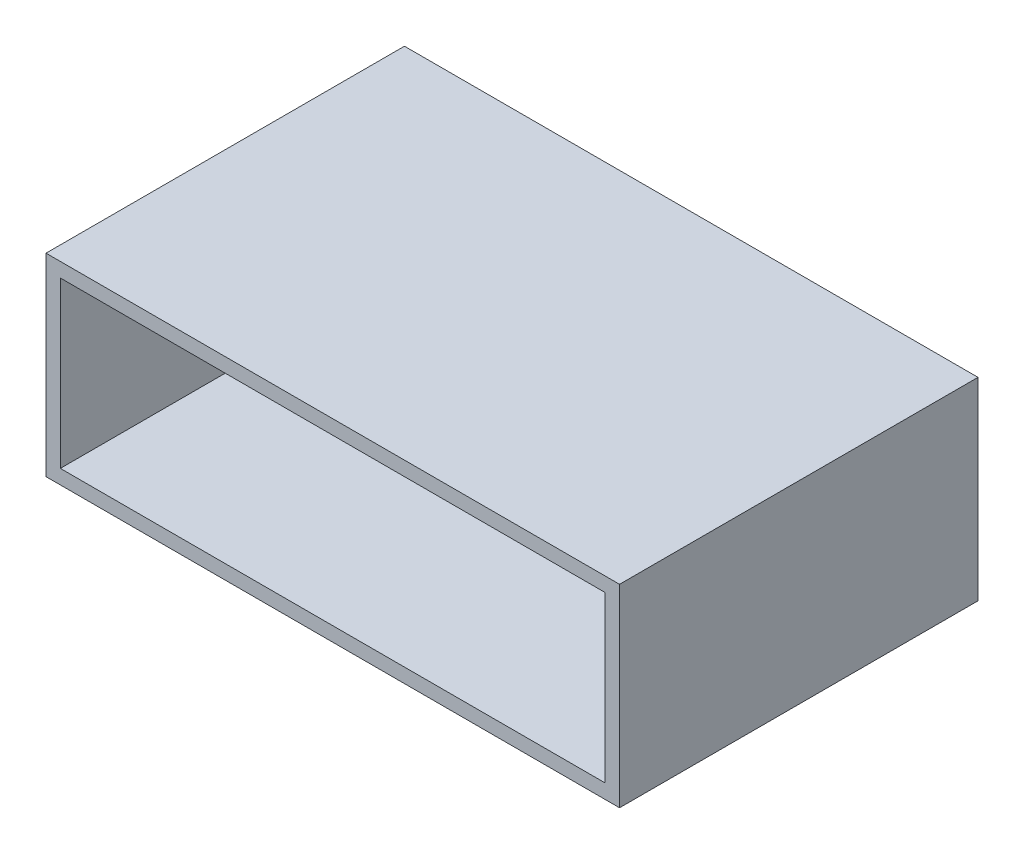
ISO-10303-21;
HEADER;
FILE_DESCRIPTION(('STEP AP214'),'2;1');
FILE_NAME('part.step','',(''),(''),'','','');
FILE_SCHEMA(('AUTOMOTIVE_DESIGN { 1 0 10303 214 1 1 1 1 }'));
ENDSEC;
DATA;
#1=APPLICATION_CONTEXT('core data for automotive mechanical design processes');
#2=APPLICATION_PROTOCOL_DEFINITION('international standard','automotive_design',2000,#1);
#3=PRODUCT_CONTEXT('',#1,'mechanical');
#4=PRODUCT('Part','Part','',(#3));
#5=PRODUCT_RELATED_PRODUCT_CATEGORY('part','',(#4));
#6=PRODUCT_DEFINITION_FORMATION('','',#4);
#7=PRODUCT_DEFINITION_CONTEXT('part definition',#1,'design');
#8=PRODUCT_DEFINITION('design','',#6,#7);
#9=PRODUCT_DEFINITION_SHAPE('','',#8);
#10=(LENGTH_UNIT() NAMED_UNIT(*) SI_UNIT(.MILLI.,.METRE.));
#11=(NAMED_UNIT(*) PLANE_ANGLE_UNIT() SI_UNIT($,.RADIAN.));
#12=(NAMED_UNIT(*) SI_UNIT($,.STERADIAN.) SOLID_ANGLE_UNIT());
#13=UNCERTAINTY_MEASURE_WITH_UNIT(LENGTH_MEASURE(1.E-05),#10,'distance_accuracy_value','');
#14=(GEOMETRIC_REPRESENTATION_CONTEXT(3) GLOBAL_UNCERTAINTY_ASSIGNED_CONTEXT((#13)) GLOBAL_UNIT_ASSIGNED_CONTEXT((#10,
#11,#12)) REPRESENTATION_CONTEXT('',''));
#15=CARTESIAN_POINT('',(0.,0.,0.));
#16=DIRECTION('',(0.,0.,1.));
#17=DIRECTION('',(1.,0.,0.));
#18=AXIS2_PLACEMENT_3D('',#15,#16,#17);
#19=CARTESIAN_POINT('',(4.,0.,-4.8));
#20=DIRECTION('',(0.,0.,-1.));
#21=DIRECTION('',(-1.,0.,0.));
#22=AXIS2_PLACEMENT_3D('',#19,#20,#21);
#23=PLANE('',#22);
#24=DIRECTION('',(1.,0.,0.));
#25=VECTOR('',#24,1.);
#26=CARTESIAN_POINT('',(0.,2.5,-4.8));
#27=LINE('',#26,#25);
#28=CARTESIAN_POINT('',(3.8,2.5,-4.8));
#29=VERTEX_POINT('',#28);
#30=CARTESIAN_POINT('',(-3.8,2.5,-4.8));
#31=VERTEX_POINT('',#30);
#32=EDGE_CURVE('E78',#29,#31,#27,.F.);
#33=ORIENTED_EDGE('',*,*,#32,.T.);
#34=DIRECTION('',(0.,1.,0.));
#35=VECTOR('',#34,1.);
#36=CARTESIAN_POINT('',(-3.8,0.,-4.8));
#37=LINE('',#36,#35);
#38=CARTESIAN_POINT('',(-3.8,0.2,-4.8));
#39=VERTEX_POINT('',#38);
#40=EDGE_CURVE('E19',#31,#39,#37,.F.);
#41=ORIENTED_EDGE('',*,*,#40,.T.);
#42=DIRECTION('',(1.,0.,0.));
#43=VECTOR('',#42,1.);
#44=CARTESIAN_POINT('',(0.,0.2,-4.8));
#45=LINE('',#44,#43);
#46=CARTESIAN_POINT('',(3.8,0.2,-4.8));
#47=VERTEX_POINT('',#46);
#48=EDGE_CURVE('E104',#47,#39,#45,.F.);
#49=ORIENTED_EDGE('',*,*,#48,.F.);
#50=DIRECTION('',(0.,1.,0.));
#51=VECTOR('',#50,1.);
#52=CARTESIAN_POINT('',(3.8,0.,-4.8));
#53=LINE('',#52,#51);
#54=EDGE_CURVE('E94',#47,#29,#53,.T.);
#55=ORIENTED_EDGE('',*,*,#54,.T.);
#56=EDGE_LOOP('',(#33,#41,#49,#55));
#57=FACE_BOUND('',#56,.T.);
#58=ADVANCED_FACE('F16',(#57),#23,.F.);
#59=CARTESIAN_POINT('',(-3.8,0.,-5.));
#60=DIRECTION('',(-1.,0.,0.));
#61=DIRECTION('',(0.,0.,1.));
#62=AXIS2_PLACEMENT_3D('',#59,#60,#61);
#63=PLANE('',#62);
#64=ORIENTED_EDGE('',*,*,#40,.F.);
#65=DIRECTION('',(0.,0.,1.));
#66=VECTOR('',#65,1.);
#67=CARTESIAN_POINT('',(-3.8,2.5,0.));
#68=LINE('',#67,#66);
#69=CARTESIAN_POINT('',(-3.8,2.5,0.));
#70=VERTEX_POINT('',#69);
#71=EDGE_CURVE('E87',#31,#70,#68,.T.);
#72=ORIENTED_EDGE('',*,*,#71,.T.);
#73=DIRECTION('',(0.,1.,0.));
#74=VECTOR('',#73,1.);
#75=CARTESIAN_POINT('',(-3.8,0.,0.));
#76=LINE('',#75,#74);
#77=CARTESIAN_POINT('',(-3.8,0.2,0.));
#78=VERTEX_POINT('',#77);
#79=EDGE_CURVE('E113',#78,#70,#76,.T.);
#80=ORIENTED_EDGE('',*,*,#79,.F.);
#81=DIRECTION('',(0.,0.,1.));
#82=VECTOR('',#81,1.);
#83=CARTESIAN_POINT('',(-3.8,0.2,0.));
#84=LINE('',#83,#82);
#85=EDGE_CURVE('E89',#39,#78,#84,.T.);
#86=ORIENTED_EDGE('',*,*,#85,.F.);
#87=EDGE_LOOP('',(#64,#72,#80,#86));
#88=FACE_BOUND('',#87,.T.);
#89=ADVANCED_FACE('F85',(#88),#63,.F.);
#90=CARTESIAN_POINT('',(0.,2.5,0.));
#91=DIRECTION('',(0.,1.,0.));
#92=DIRECTION('',(0.,0.,1.));
#93=AXIS2_PLACEMENT_3D('',#90,#91,#92);
#94=PLANE('',#93);
#95=ORIENTED_EDGE('',*,*,#32,.F.);
#96=DIRECTION('',(0.,0.,-1.));
#97=VECTOR('',#96,1.);
#98=CARTESIAN_POINT('',(3.8,2.5,0.));
#99=LINE('',#98,#97);
#100=CARTESIAN_POINT('',(3.8,2.5,0.));
#101=VERTEX_POINT('',#100);
#102=EDGE_CURVE('E99',#29,#101,#99,.F.);
#103=ORIENTED_EDGE('',*,*,#102,.T.);
#104=DIRECTION('',(1.,0.,0.));
#105=VECTOR('',#104,1.);
#106=CARTESIAN_POINT('',(-4.,2.5,0.));
#107=LINE('',#106,#105);
#108=EDGE_CURVE('E93',#70,#101,#107,.T.);
#109=ORIENTED_EDGE('',*,*,#108,.F.);
#110=ORIENTED_EDGE('',*,*,#71,.F.);
#111=EDGE_LOOP('',(#95,#103,#109,#110));
#112=FACE_BOUND('',#111,.T.);
#113=ADVANCED_FACE('F92',(#112),#94,.F.);
#114=CARTESIAN_POINT('',(3.8,0.,0.));
#115=DIRECTION('',(1.,0.,0.));
#116=DIRECTION('',(0.,0.,-1.));
#117=AXIS2_PLACEMENT_3D('',#114,#115,#116);
#118=PLANE('',#117);
#119=ORIENTED_EDGE('',*,*,#54,.F.);
#120=DIRECTION('',(0.,0.,1.));
#121=VECTOR('',#120,1.);
#122=CARTESIAN_POINT('',(3.8,0.2,0.));
#123=LINE('',#122,#121);
#124=CARTESIAN_POINT('',(3.8,0.2,0.));
#125=VERTEX_POINT('',#124);
#126=EDGE_CURVE('E101',#125,#47,#123,.F.);
#127=ORIENTED_EDGE('',*,*,#126,.F.);
#128=DIRECTION('',(0.,1.,0.));
#129=VECTOR('',#128,1.);
#130=CARTESIAN_POINT('',(3.8,0.,0.));
#131=LINE('',#130,#129);
#132=EDGE_CURVE('E116',#101,#125,#131,.F.);
#133=ORIENTED_EDGE('',*,*,#132,.F.);
#134=ORIENTED_EDGE('',*,*,#102,.F.);
#135=EDGE_LOOP('',(#119,#127,#133,#134));
#136=FACE_BOUND('',#135,.T.);
#137=ADVANCED_FACE('F177',(#136),#118,.F.);
#138=CARTESIAN_POINT('',(0.,0.2,0.));
#139=DIRECTION('',(0.,1.,0.));
#140=DIRECTION('',(0.,0.,1.));
#141=AXIS2_PLACEMENT_3D('',#138,#139,#140);
#142=PLANE('',#141);
#143=ORIENTED_EDGE('',*,*,#85,.T.);
#144=DIRECTION('',(1.,0.,0.));
#145=VECTOR('',#144,1.);
#146=CARTESIAN_POINT('',(-4.,0.2,0.));
#147=LINE('',#146,#145);
#148=EDGE_CURVE('E118',#125,#78,#147,.F.);
#149=ORIENTED_EDGE('',*,*,#148,.F.);
#150=ORIENTED_EDGE('',*,*,#126,.T.);
#151=ORIENTED_EDGE('',*,*,#48,.T.);
#152=EDGE_LOOP('',(#143,#149,#150,#151));
#153=FACE_BOUND('',#152,.T.);
#154=ADVANCED_FACE('F173',(#153),#142,.T.);
#155=CARTESIAN_POINT('',(0.,2.7,0.));
#156=DIRECTION('',(0.,1.,0.));
#157=DIRECTION('',(0.,0.,1.));
#158=AXIS2_PLACEMENT_3D('',#155,#156,#157);
#159=PLANE('',#158);
#160=DIRECTION('',(-1.,0.,0.));
#161=VECTOR('',#160,1.);
#162=CARTESIAN_POINT('',(4.,2.7,-5.));
#163=LINE('',#162,#161);
#164=CARTESIAN_POINT('',(-4.,2.7,-5.));
#165=VERTEX_POINT('',#164);
#166=CARTESIAN_POINT('',(4.,2.7,-5.));
#167=VERTEX_POINT('',#166);
#168=EDGE_CURVE('E128',#165,#167,#163,.F.);
#169=ORIENTED_EDGE('',*,*,#168,.F.);
#170=DIRECTION('',(0.,0.,1.));
#171=VECTOR('',#170,1.);
#172=CARTESIAN_POINT('',(-4.,2.7,-5.));
#173=LINE('',#172,#171);
#174=CARTESIAN_POINT('',(-4.,2.7,0.));
#175=VERTEX_POINT('',#174);
#176=EDGE_CURVE('E107',#175,#165,#173,.F.);
#177=ORIENTED_EDGE('',*,*,#176,.F.);
#178=DIRECTION('',(1.,0.,0.));
#179=VECTOR('',#178,1.);
#180=CARTESIAN_POINT('',(-4.,2.7,0.));
#181=LINE('',#180,#179);
#182=CARTESIAN_POINT('',(4.,2.7,0.));
#183=VERTEX_POINT('',#182);
#184=EDGE_CURVE('E109',#183,#175,#181,.F.);
#185=ORIENTED_EDGE('',*,*,#184,.F.);
#186=DIRECTION('',(0.,0.,-1.));
#187=VECTOR('',#186,1.);
#188=CARTESIAN_POINT('',(4.,2.7,0.));
#189=LINE('',#188,#187);
#190=EDGE_CURVE('E121',#167,#183,#189,.F.);
#191=ORIENTED_EDGE('',*,*,#190,.F.);
#192=EDGE_LOOP('',(#169,#177,#185,#191));
#193=FACE_BOUND('',#192,.T.);
#194=ADVANCED_FACE('F170',(#193),#159,.T.);
#195=CARTESIAN_POINT('',(-4.,0.,-5.));
#196=DIRECTION('',(-1.,0.,0.));
#197=DIRECTION('',(0.,0.,1.));
#198=AXIS2_PLACEMENT_3D('',#195,#196,#197);
#199=PLANE('',#198);
#200=DIRECTION('',(0.,1.,0.));
#201=VECTOR('',#200,1.);
#202=CARTESIAN_POINT('',(-4.,0.,-5.));
#203=LINE('',#202,#201);
#204=CARTESIAN_POINT('',(-4.,0.,-5.));
#205=VERTEX_POINT('',#204);
#206=EDGE_CURVE('E125',#205,#165,#203,.T.);
#207=ORIENTED_EDGE('',*,*,#206,.F.);
#208=DIRECTION('',(0.,0.,1.));
#209=VECTOR('',#208,1.);
#210=CARTESIAN_POINT('',(-4.,0.,0.));
#211=LINE('',#210,#209);
#212=CARTESIAN_POINT('',(-4.,0.,0.));
#213=VERTEX_POINT('',#212);
#214=EDGE_CURVE('E131',#205,#213,#211,.T.);
#215=ORIENTED_EDGE('',*,*,#214,.T.);
#216=DIRECTION('',(0.,1.,0.));
#217=VECTOR('',#216,1.);
#218=CARTESIAN_POINT('',(-4.,0.,0.));
#219=LINE('',#218,#217);
#220=EDGE_CURVE('E111',#175,#213,#219,.F.);
#221=ORIENTED_EDGE('',*,*,#220,.F.);
#222=ORIENTED_EDGE('',*,*,#176,.T.);
#223=EDGE_LOOP('',(#207,#215,#221,#222));
#224=FACE_BOUND('',#223,.T.);
#225=ADVANCED_FACE('F152',(#224),#199,.T.);
#226=CARTESIAN_POINT('',(-4.,0.,0.));
#227=DIRECTION('',(0.,0.,1.));
#228=DIRECTION('',(1.,0.,0.));
#229=AXIS2_PLACEMENT_3D('',#226,#227,#228);
#230=PLANE('',#229);
#231=ORIENTED_EDGE('',*,*,#132,.T.);
#232=ORIENTED_EDGE('',*,*,#148,.T.);
#233=ORIENTED_EDGE('',*,*,#79,.T.);
#234=ORIENTED_EDGE('',*,*,#108,.T.);
#235=EDGE_LOOP('',(#231,#232,#233,#234));
#236=FACE_BOUND('',#235,.T.);
#237=ORIENTED_EDGE('',*,*,#220,.T.);
#238=DIRECTION('',(1.,0.,0.));
#239=VECTOR('',#238,1.);
#240=CARTESIAN_POINT('',(0.,0.,0.));
#241=LINE('',#240,#239);
#242=CARTESIAN_POINT('',(4.,0.,0.));
#243=VERTEX_POINT('',#242);
#244=EDGE_CURVE('E134',#213,#243,#241,.T.);
#245=ORIENTED_EDGE('',*,*,#244,.T.);
#246=DIRECTION('',(0.,1.,0.));
#247=VECTOR('',#246,1.);
#248=CARTESIAN_POINT('',(4.,0.,0.));
#249=LINE('',#248,#247);
#250=EDGE_CURVE('E123',#183,#243,#249,.F.);
#251=ORIENTED_EDGE('',*,*,#250,.F.);
#252=ORIENTED_EDGE('',*,*,#184,.T.);
#253=EDGE_LOOP('',(#237,#245,#251,#252));
#254=FACE_BOUND('',#253,.T.);
#255=ADVANCED_FACE('F146',(#236,#254),#230,.T.);
#256=CARTESIAN_POINT('',(4.,0.,0.));
#257=DIRECTION('',(1.,0.,0.));
#258=DIRECTION('',(0.,0.,-1.));
#259=AXIS2_PLACEMENT_3D('',#256,#257,#258);
#260=PLANE('',#259);
#261=ORIENTED_EDGE('',*,*,#250,.T.);
#262=DIRECTION('',(0.,0.,1.));
#263=VECTOR('',#262,1.);
#264=CARTESIAN_POINT('',(4.,0.,0.));
#265=LINE('',#264,#263);
#266=CARTESIAN_POINT('',(4.,0.,-5.));
#267=VERTEX_POINT('',#266);
#268=EDGE_CURVE('E25',#243,#267,#265,.F.);
#269=ORIENTED_EDGE('',*,*,#268,.T.);
#270=DIRECTION('',(0.,1.,0.));
#271=VECTOR('',#270,1.);
#272=CARTESIAN_POINT('',(4.,0.,-5.));
#273=LINE('',#272,#271);
#274=EDGE_CURVE('E33',#167,#267,#273,.F.);
#275=ORIENTED_EDGE('',*,*,#274,.F.);
#276=ORIENTED_EDGE('',*,*,#190,.T.);
#277=EDGE_LOOP('',(#261,#269,#275,#276));
#278=FACE_BOUND('',#277,.T.);
#279=ADVANCED_FACE('F140',(#278),#260,.T.);
#280=CARTESIAN_POINT('',(4.,0.,-5.));
#281=DIRECTION('',(0.,0.,-1.));
#282=DIRECTION('',(-1.,0.,0.));
#283=AXIS2_PLACEMENT_3D('',#280,#281,#282);
#284=PLANE('',#283);
#285=ORIENTED_EDGE('',*,*,#274,.T.);
#286=DIRECTION('',(1.,0.,0.));
#287=VECTOR('',#286,1.);
#288=CARTESIAN_POINT('',(0.,0.,-5.));
#289=LINE('',#288,#287);
#290=EDGE_CURVE('E11',#267,#205,#289,.F.);
#291=ORIENTED_EDGE('',*,*,#290,.T.);
#292=ORIENTED_EDGE('',*,*,#206,.T.);
#293=ORIENTED_EDGE('',*,*,#168,.T.);
#294=EDGE_LOOP('',(#285,#291,#292,#293));
#295=FACE_BOUND('',#294,.T.);
#296=ADVANCED_FACE('F154',(#295),#284,.T.);
#297=CARTESIAN_POINT('',(0.,0.,0.));
#298=DIRECTION('',(0.,1.,0.));
#299=DIRECTION('',(0.,0.,1.));
#300=AXIS2_PLACEMENT_3D('',#297,#298,#299);
#301=PLANE('',#300);
#302=ORIENTED_EDGE('',*,*,#268,.F.);
#303=ORIENTED_EDGE('',*,*,#244,.F.);
#304=ORIENTED_EDGE('',*,*,#214,.F.);
#305=ORIENTED_EDGE('',*,*,#290,.F.);
#306=EDGE_LOOP('',(#302,#303,#304,#305));
#307=FACE_BOUND('',#306,.T.);
#308=ADVANCED_FACE('F144',(#307),#301,.F.);
#309=CLOSED_SHELL('',(#58,#89,#113,#137,#154,#194,#225,#255,#279,#296,#308));
#310=MANIFOLD_SOLID_BREP('B1',#309);
#311=ADVANCED_BREP_SHAPE_REPRESENTATION('',(#18,#310),#14);
#312=SHAPE_DEFINITION_REPRESENTATION(#9,#311);
ENDSEC;
END-ISO-10303-21;
